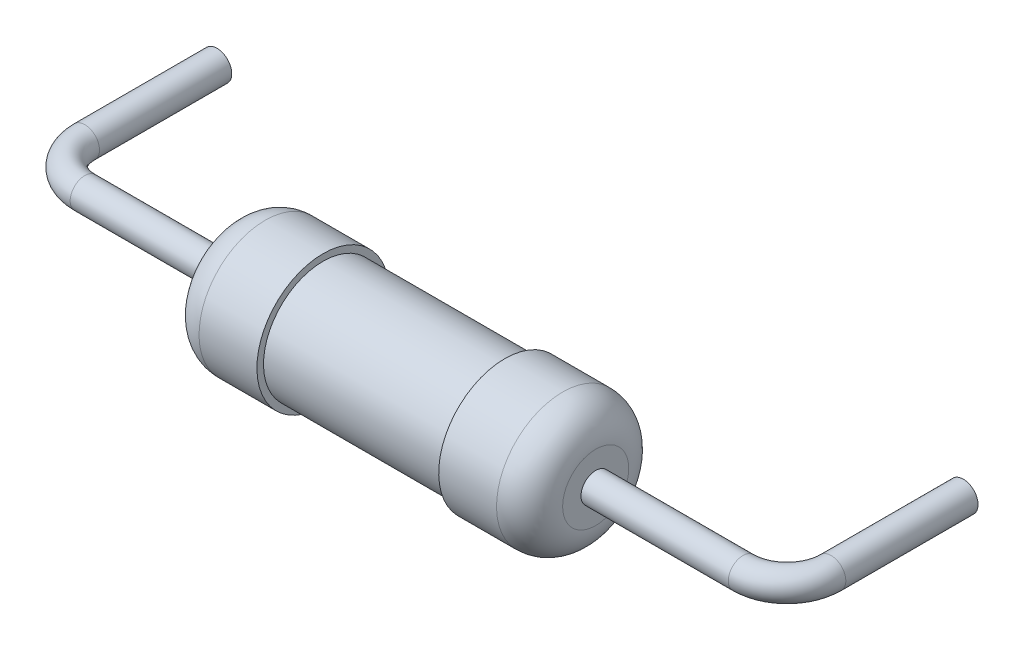
ISO-10303-21;
HEADER;
FILE_DESCRIPTION(('STEP AP214'),'2;1');
FILE_NAME('part.step','',(''),(''),'','','');
FILE_SCHEMA(('AUTOMOTIVE_DESIGN { 1 0 10303 214 1 1 1 1 }'));
ENDSEC;
DATA;
#1=APPLICATION_CONTEXT('core data for automotive mechanical design processes');
#2=APPLICATION_PROTOCOL_DEFINITION('international standard','automotive_design',2000,#1);
#3=PRODUCT_CONTEXT('',#1,'mechanical');
#4=PRODUCT('Part','Part','',(#3));
#5=PRODUCT_RELATED_PRODUCT_CATEGORY('part','',(#4));
#6=PRODUCT_DEFINITION_FORMATION('','',#4);
#7=PRODUCT_DEFINITION_CONTEXT('part definition',#1,'design');
#8=PRODUCT_DEFINITION('design','',#6,#7);
#9=PRODUCT_DEFINITION_SHAPE('','',#8);
#10=(LENGTH_UNIT() NAMED_UNIT(*) SI_UNIT(.MILLI.,.METRE.));
#11=(NAMED_UNIT(*) PLANE_ANGLE_UNIT() SI_UNIT($,.RADIAN.));
#12=(NAMED_UNIT(*) SI_UNIT($,.STERADIAN.) SOLID_ANGLE_UNIT());
#13=UNCERTAINTY_MEASURE_WITH_UNIT(LENGTH_MEASURE(1.E-05),#10,'distance_accuracy_value','');
#14=(GEOMETRIC_REPRESENTATION_CONTEXT(3) GLOBAL_UNCERTAINTY_ASSIGNED_CONTEXT((#13)) GLOBAL_UNIT_ASSIGNED_CONTEXT((#10,
#11,#12)) REPRESENTATION_CONTEXT('',''));
#15=CARTESIAN_POINT('',(0.,0.,0.));
#16=DIRECTION('',(0.,0.,1.));
#17=DIRECTION('',(1.,0.,0.));
#18=AXIS2_PLACEMENT_3D('',#15,#16,#17);
#19=CARTESIAN_POINT('',(19.92,0.,-3.));
#20=DIRECTION('',(0.,0.,1.));
#21=DIRECTION('',(1.,0.,0.));
#22=AXIS2_PLACEMENT_3D('',#19,#20,#21);
#23=PLANE('',#22);
#24=CARTESIAN_POINT('',(20.32,0.,-3.));
#25=DIRECTION('',(0.,0.,-1.));
#26=DIRECTION('',(-1.,0.,0.));
#27=AXIS2_PLACEMENT_3D('',#24,#25,#26);
#28=CIRCLE('',#27,0.4);
#29=CARTESIAN_POINT('',(19.92,0.,-3.));
#30=VERTEX_POINT('',#29);
#31=EDGE_CURVE('E11',#30,#30,#28,.T.);
#32=ORIENTED_EDGE('',*,*,#31,.T.);
#33=EDGE_LOOP('',(#32));
#34=FACE_BOUND('',#33,.T.);
#35=ADVANCED_FACE('F17',(#34),#23,.F.);
#36=CARTESIAN_POINT('',(20.32,0.,0.6));
#37=DIRECTION('',(0.,0.,-1.));
#38=DIRECTION('',(-1.,0.,0.));
#39=AXIS2_PLACEMENT_3D('',#36,#37,#38);
#40=CYLINDRICAL_SURFACE('',#39,0.4);
#41=DIRECTION('',(0.,0.,-1.));
#42=VECTOR('',#41,1.);
#43=CARTESIAN_POINT('',(19.92,0.,0.6));
#44=LINE('',#43,#42);
#45=CARTESIAN_POINT('',(19.92,0.,0.6));
#46=VERTEX_POINT('',#45);
#47=EDGE_CURVE('E26',#46,#30,#44,.T.);
#48=ORIENTED_EDGE('',*,*,#47,.T.);
#49=ORIENTED_EDGE('',*,*,#31,.F.);
#50=ORIENTED_EDGE('',*,*,#47,.F.);
#51=CARTESIAN_POINT('',(20.32,0.,0.6));
#52=DIRECTION('',(0.,0.,1.));
#53=DIRECTION('',(1.,0.,0.));
#54=AXIS2_PLACEMENT_3D('',#51,#52,#53);
#55=CIRCLE('',#54,0.4);
#56=EDGE_CURVE('E130',#46,#46,#55,.T.);
#57=ORIENTED_EDGE('',*,*,#56,.F.);
#58=EDGE_LOOP('',(#48,#49,#50,#57));
#59=FACE_BOUND('',#58,.T.);
#60=ADVANCED_FACE('F233',(#59),#40,.T.);
#61=CARTESIAN_POINT('',(19.12,0.,0.6));
#62=DIRECTION('',(0.,1.,0.));
#63=DIRECTION('',(0.,0.,1.));
#64=AXIS2_PLACEMENT_3D('',#61,#62,#63);
#65=TOROIDAL_SURFACE('',#64,1.2,0.4);
#66=CARTESIAN_POINT('',(19.12,0.,0.6));
#67=DIRECTION('',(0.,1.,0.));
#68=DIRECTION('',(0.,0.,1.));
#69=AXIS2_PLACEMENT_3D('',#66,#67,#68);
#70=CIRCLE('',#69,0.8);
#71=CARTESIAN_POINT('',(19.12,0.,1.4));
#72=VERTEX_POINT('',#71);
#73=EDGE_CURVE('E127',#72,#46,#70,.T.);
#74=ORIENTED_EDGE('',*,*,#73,.T.);
#75=ORIENTED_EDGE('',*,*,#56,.T.);
#76=ORIENTED_EDGE('',*,*,#73,.F.);
#77=CARTESIAN_POINT('',(19.12,0.,1.8));
#78=DIRECTION('',(1.,0.,0.));
#79=DIRECTION('',(0.,0.,-1.));
#80=AXIS2_PLACEMENT_3D('',#77,#78,#79);
#81=CIRCLE('',#80,0.4);
#82=EDGE_CURVE('E124',#72,#72,#81,.T.);
#83=ORIENTED_EDGE('',*,*,#82,.T.);
#84=EDGE_LOOP('',(#74,#75,#76,#83));
#85=FACE_BOUND('',#84,.T.);
#86=ADVANCED_FACE('F239',(#85),#65,.T.);
#87=CARTESIAN_POINT('',(1.2,0.,1.8));
#88=DIRECTION('',(1.,0.,0.));
#89=DIRECTION('',(0.,0.,-1.));
#90=AXIS2_PLACEMENT_3D('',#87,#88,#89);
#91=CYLINDRICAL_SURFACE('',#90,0.4);
#92=CARTESIAN_POINT('',(15.11,0.,1.8));
#93=DIRECTION('',(1.,0.,0.));
#94=DIRECTION('',(0.,0.,-1.));
#95=AXIS2_PLACEMENT_3D('',#92,#93,#94);
#96=CIRCLE('',#95,0.4);
#97=CARTESIAN_POINT('',(15.11,0.,1.4));
#98=VERTEX_POINT('',#97);
#99=EDGE_CURVE('E116',#98,#98,#96,.T.);
#100=ORIENTED_EDGE('',*,*,#99,.T.);
#101=DIRECTION('',(1.,0.,0.));
#102=VECTOR('',#101,1.);
#103=CARTESIAN_POINT('',(1.2,0.,1.4));
#104=LINE('',#103,#102);
#105=EDGE_CURVE('E120',#98,#72,#104,.T.);
#106=ORIENTED_EDGE('',*,*,#105,.T.);
#107=ORIENTED_EDGE('',*,*,#82,.F.);
#108=ORIENTED_EDGE('',*,*,#105,.F.);
#109=EDGE_LOOP('',(#100,#106,#107,#108));
#110=FACE_BOUND('',#109,.T.);
#111=ADVANCED_FACE('F243',(#110),#91,.T.);
#112=CARTESIAN_POINT('',(15.11,1.8,1.8));
#113=DIRECTION('',(-1.,0.,0.));
#114=DIRECTION('',(0.,0.,1.));
#115=AXIS2_PLACEMENT_3D('',#112,#113,#114);
#116=PLANE('',#115);
#117=ORIENTED_EDGE('',*,*,#99,.F.);
#118=EDGE_LOOP('',(#117));
#119=FACE_BOUND('',#118,.T.);
#120=CARTESIAN_POINT('',(15.11,0.,1.8));
#121=DIRECTION('',(1.,0.,0.));
#122=DIRECTION('',(0.,1.,0.));
#123=AXIS2_PLACEMENT_3D('',#120,#121,#122);
#124=CIRCLE('',#123,0.9);
#125=CARTESIAN_POINT('',(15.11,0.9,1.8));
#126=VERTEX_POINT('',#125);
#127=EDGE_CURVE('E108',#126,#126,#124,.T.);
#128=ORIENTED_EDGE('',*,*,#127,.T.);
#129=EDGE_LOOP('',(#128));
#130=FACE_BOUND('',#129,.T.);
#131=ADVANCED_FACE('F248',(#119,#130),#116,.F.);
#132=CARTESIAN_POINT('',(0.4,0.,-3.));
#133=DIRECTION('',(0.,0.,-1.));
#134=DIRECTION('',(0.,-1.,0.));
#135=AXIS2_PLACEMENT_3D('',#132,#133,#134);
#136=PLANE('',#135);
#137=CARTESIAN_POINT('',(0.,0.,-3.));
#138=DIRECTION('',(0.,0.,1.));
#139=DIRECTION('',(1.,0.,0.));
#140=AXIS2_PLACEMENT_3D('',#137,#138,#139);
#141=CIRCLE('',#140,0.4);
#142=CARTESIAN_POINT('',(0.4,0.,-3.));
#143=VERTEX_POINT('',#142);
#144=EDGE_CURVE('E95',#143,#143,#141,.T.);
#145=ORIENTED_EDGE('',*,*,#144,.F.);
#146=EDGE_LOOP('',(#145));
#147=FACE_BOUND('',#146,.T.);
#148=ADVANCED_FACE('F250',(#147),#136,.T.);
#149=CARTESIAN_POINT('',(14.21,0.,1.8));
#150=DIRECTION('',(1.,0.,0.));
#151=DIRECTION('',(0.,1.,0.));
#152=AXIS2_PLACEMENT_3D('',#149,#150,#151);
#153=DEGENERATE_TOROIDAL_SURFACE('',#152,0.9,0.9,.T.);
#154=CARTESIAN_POINT('',(14.21,0.9,1.8));
#155=DIRECTION('',(0.,0.,-1.));
#156=DIRECTION('',(0.,1.,0.));
#157=AXIS2_PLACEMENT_3D('',#154,#155,#156);
#158=CIRCLE('',#157,0.9);
#159=CARTESIAN_POINT('',(14.21,1.8,1.8));
#160=VERTEX_POINT('',#159);
#161=EDGE_CURVE('E102',#160,#126,#158,.T.);
#162=ORIENTED_EDGE('',*,*,#161,.F.);
#163=CARTESIAN_POINT('',(14.21,0.,1.8));
#164=DIRECTION('',(1.,0.,0.));
#165=DIRECTION('',(0.,1.,0.));
#166=AXIS2_PLACEMENT_3D('',#163,#164,#165);
#167=CIRCLE('',#166,1.8);
#168=EDGE_CURVE('E110',#160,#160,#167,.T.);
#169=ORIENTED_EDGE('',*,*,#168,.T.);
#170=ORIENTED_EDGE('',*,*,#161,.T.);
#171=ORIENTED_EDGE('',*,*,#127,.F.);
#172=EDGE_LOOP('',(#162,#169,#170,#171));
#173=FACE_BOUND('',#172,.T.);
#174=ADVANCED_FACE('F251',(#173),#153,.T.);
#175=CARTESIAN_POINT('',(0.,0.,-3.));
#176=DIRECTION('',(0.,0.,1.));
#177=DIRECTION('',(1.,0.,0.));
#178=AXIS2_PLACEMENT_3D('',#175,#176,#177);
#179=CYLINDRICAL_SURFACE('',#178,0.4);
#180=DIRECTION('',(0.,0.,1.));
#181=VECTOR('',#180,1.);
#182=CARTESIAN_POINT('',(0.4,0.,-3.));
#183=LINE('',#182,#181);
#184=CARTESIAN_POINT('',(0.4,0.,0.6));
#185=VERTEX_POINT('',#184);
#186=EDGE_CURVE('E98',#143,#185,#183,.T.);
#187=ORIENTED_EDGE('',*,*,#186,.T.);
#188=CARTESIAN_POINT('',(0.,0.,0.6));
#189=DIRECTION('',(0.,0.,1.));
#190=DIRECTION('',(1.,0.,0.));
#191=AXIS2_PLACEMENT_3D('',#188,#189,#190);
#192=CIRCLE('',#191,0.4);
#193=EDGE_CURVE('E149',#185,#185,#192,.T.);
#194=ORIENTED_EDGE('',*,*,#193,.F.);
#195=ORIENTED_EDGE('',*,*,#186,.F.);
#196=ORIENTED_EDGE('',*,*,#144,.T.);
#197=EDGE_LOOP('',(#187,#194,#195,#196));
#198=FACE_BOUND('',#197,.T.);
#199=ADVANCED_FACE('F96',(#198),#179,.T.);
#200=CARTESIAN_POINT('',(12.635,0.,1.8));
#201=DIRECTION('',(-1.,0.,0.));
#202=DIRECTION('',(0.,1.,0.));
#203=AXIS2_PLACEMENT_3D('',#200,#201,#202);
#204=CYLINDRICAL_SURFACE('',#203,1.8);
#205=CARTESIAN_POINT('',(12.635,0.,1.8));
#206=DIRECTION('',(1.,0.,0.));
#207=DIRECTION('',(0.,1.,0.));
#208=AXIS2_PLACEMENT_3D('',#205,#206,#207);
#209=CIRCLE('',#208,1.8);
#210=CARTESIAN_POINT('',(12.635,1.8,1.8));
#211=VERTEX_POINT('',#210);
#212=EDGE_CURVE('E162',#211,#211,#209,.T.);
#213=ORIENTED_EDGE('',*,*,#212,.T.);
#214=DIRECTION('',(1.,0.,0.));
#215=VECTOR('',#214,1.);
#216=CARTESIAN_POINT('',(12.635,1.8,1.8));
#217=LINE('',#216,#215);
#218=EDGE_CURVE('E147',#211,#160,#217,.T.);
#219=ORIENTED_EDGE('',*,*,#218,.T.);
#220=ORIENTED_EDGE('',*,*,#168,.F.);
#221=ORIENTED_EDGE('',*,*,#218,.F.);
#222=EDGE_LOOP('',(#213,#219,#220,#221));
#223=FACE_BOUND('',#222,.T.);
#224=ADVANCED_FACE('F253',(#223),#204,.T.);
#225=CARTESIAN_POINT('',(1.2,0.,0.6));
#226=DIRECTION('',(0.,1.,0.));
#227=DIRECTION('',(-1.,0.,0.));
#228=AXIS2_PLACEMENT_3D('',#225,#226,#227);
#229=TOROIDAL_SURFACE('',#228,1.2,0.4);
#230=CARTESIAN_POINT('',(1.2,0.,0.6));
#231=DIRECTION('',(0.,1.,0.));
#232=DIRECTION('',(-1.,0.,0.));
#233=AXIS2_PLACEMENT_3D('',#230,#231,#232);
#234=CIRCLE('',#233,0.8);
#235=CARTESIAN_POINT('',(1.2,0.,1.4));
#236=VERTEX_POINT('',#235);
#237=EDGE_CURVE('E145',#185,#236,#234,.T.);
#238=ORIENTED_EDGE('',*,*,#237,.T.);
#239=CARTESIAN_POINT('',(1.2,0.,1.8));
#240=DIRECTION('',(-1.,0.,0.));
#241=DIRECTION('',(0.,0.,1.));
#242=AXIS2_PLACEMENT_3D('',#239,#240,#241);
#243=CIRCLE('',#242,0.4);
#244=EDGE_CURVE('E168',#236,#236,#243,.T.);
#245=ORIENTED_EDGE('',*,*,#244,.T.);
#246=ORIENTED_EDGE('',*,*,#237,.F.);
#247=ORIENTED_EDGE('',*,*,#193,.T.);
#248=EDGE_LOOP('',(#238,#245,#246,#247));
#249=FACE_BOUND('',#248,.T.);
#250=ADVANCED_FACE('F256',(#249),#229,.T.);
#251=CARTESIAN_POINT('',(12.635,1.8,1.8));
#252=DIRECTION('',(-1.,0.,0.));
#253=DIRECTION('',(0.,0.,1.));
#254=AXIS2_PLACEMENT_3D('',#251,#252,#253);
#255=PLANE('',#254);
#256=CARTESIAN_POINT('',(12.635,0.,1.8));
#257=DIRECTION('',(-1.,0.,0.));
#258=DIRECTION('',(0.,1.,0.));
#259=AXIS2_PLACEMENT_3D('',#256,#257,#258);
#260=CIRCLE('',#259,1.62);
#261=CARTESIAN_POINT('',(12.635,1.62,1.8));
#262=VERTEX_POINT('',#261);
#263=EDGE_CURVE('E171',#262,#262,#260,.T.);
#264=ORIENTED_EDGE('',*,*,#263,.F.);
#265=EDGE_LOOP('',(#264));
#266=FACE_BOUND('',#265,.T.);
#267=ORIENTED_EDGE('',*,*,#212,.F.);
#268=EDGE_LOOP('',(#267));
#269=FACE_BOUND('',#268,.T.);
#270=ADVANCED_FACE('F259',(#266,#269),#255,.T.);
#271=CARTESIAN_POINT('',(1.2,0.,1.8));
#272=DIRECTION('',(1.,0.,0.));
#273=DIRECTION('',(0.,0.,-1.));
#274=AXIS2_PLACEMENT_3D('',#271,#272,#273);
#275=CYLINDRICAL_SURFACE('',#274,0.4);
#276=ORIENTED_EDGE('',*,*,#244,.F.);
#277=DIRECTION('',(1.,0.,0.));
#278=VECTOR('',#277,1.);
#279=CARTESIAN_POINT('',(1.2,0.,1.4));
#280=LINE('',#279,#278);
#281=CARTESIAN_POINT('',(5.21,0.,1.4));
#282=VERTEX_POINT('',#281);
#283=EDGE_CURVE('E165',#236,#282,#280,.T.);
#284=ORIENTED_EDGE('',*,*,#283,.T.);
#285=CARTESIAN_POINT('',(5.21,0.,1.8));
#286=DIRECTION('',(1.,0.,0.));
#287=DIRECTION('',(0.,0.,-1.));
#288=AXIS2_PLACEMENT_3D('',#285,#286,#287);
#289=CIRCLE('',#288,0.4);
#290=EDGE_CURVE('E177',#282,#282,#289,.T.);
#291=ORIENTED_EDGE('',*,*,#290,.F.);
#292=ORIENTED_EDGE('',*,*,#283,.F.);
#293=EDGE_LOOP('',(#276,#284,#291,#292));
#294=FACE_BOUND('',#293,.T.);
#295=ADVANCED_FACE('F228',(#294),#275,.T.);
#296=CARTESIAN_POINT('',(5.21,0.,1.8));
#297=DIRECTION('',(-1.,0.,0.));
#298=DIRECTION('',(0.,1.,0.));
#299=AXIS2_PLACEMENT_3D('',#296,#297,#298);
#300=CYLINDRICAL_SURFACE('',#299,1.62);
#301=ORIENTED_EDGE('',*,*,#263,.T.);
#302=DIRECTION('',(1.,0.,0.));
#303=VECTOR('',#302,1.);
#304=CARTESIAN_POINT('',(5.21,1.62,1.8));
#305=LINE('',#304,#303);
#306=CARTESIAN_POINT('',(7.685,1.62,1.8));
#307=VERTEX_POINT('',#306);
#308=EDGE_CURVE('E169',#307,#262,#305,.T.);
#309=ORIENTED_EDGE('',*,*,#308,.F.);
#310=CARTESIAN_POINT('',(7.685,0.,1.8));
#311=DIRECTION('',(-1.,0.,0.));
#312=DIRECTION('',(0.,1.,0.));
#313=AXIS2_PLACEMENT_3D('',#310,#311,#312);
#314=CIRCLE('',#313,1.62);
#315=EDGE_CURVE('E173',#307,#307,#314,.T.);
#316=ORIENTED_EDGE('',*,*,#315,.F.);
#317=ORIENTED_EDGE('',*,*,#308,.T.);
#318=EDGE_LOOP('',(#301,#309,#316,#317));
#319=FACE_BOUND('',#318,.T.);
#320=ADVANCED_FACE('F217',(#319),#300,.T.);
#321=CARTESIAN_POINT('',(5.21,1.8,1.8));
#322=DIRECTION('',(-1.,0.,0.));
#323=DIRECTION('',(0.,0.,1.));
#324=AXIS2_PLACEMENT_3D('',#321,#322,#323);
#325=PLANE('',#324);
#326=ORIENTED_EDGE('',*,*,#290,.T.);
#327=EDGE_LOOP('',(#326));
#328=FACE_BOUND('',#327,.T.);
#329=CARTESIAN_POINT('',(5.21,0.,1.8));
#330=DIRECTION('',(1.,0.,0.));
#331=DIRECTION('',(0.,1.,0.));
#332=AXIS2_PLACEMENT_3D('',#329,#330,#331);
#333=CIRCLE('',#332,0.9);
#334=CARTESIAN_POINT('',(5.21,0.9,1.8));
#335=VERTEX_POINT('',#334);
#336=EDGE_CURVE('E184',#335,#335,#333,.T.);
#337=ORIENTED_EDGE('',*,*,#336,.F.);
#338=EDGE_LOOP('',(#337));
#339=FACE_BOUND('',#338,.T.);
#340=ADVANCED_FACE('F214',(#328,#339),#325,.T.);
#341=CARTESIAN_POINT('',(7.685,1.8,1.8));
#342=DIRECTION('',(-1.,0.,0.));
#343=DIRECTION('',(0.,0.,1.));
#344=AXIS2_PLACEMENT_3D('',#341,#342,#343);
#345=PLANE('',#344);
#346=ORIENTED_EDGE('',*,*,#315,.T.);
#347=EDGE_LOOP('',(#346));
#348=FACE_BOUND('',#347,.T.);
#349=CARTESIAN_POINT('',(7.685,0.,1.8));
#350=DIRECTION('',(1.,0.,0.));
#351=DIRECTION('',(0.,1.,0.));
#352=AXIS2_PLACEMENT_3D('',#349,#350,#351);
#353=CIRCLE('',#352,1.8);
#354=CARTESIAN_POINT('',(7.685,1.8,1.8));
#355=VERTEX_POINT('',#354);
#356=EDGE_CURVE('E191',#355,#355,#353,.T.);
#357=ORIENTED_EDGE('',*,*,#356,.T.);
#358=EDGE_LOOP('',(#357));
#359=FACE_BOUND('',#358,.T.);
#360=ADVANCED_FACE('F216',(#348,#359),#345,.F.);
#361=CARTESIAN_POINT('',(6.11,0.,1.8));
#362=DIRECTION('',(-1.,0.,0.));
#363=DIRECTION('',(0.,1.,0.));
#364=AXIS2_PLACEMENT_3D('',#361,#362,#363);
#365=DEGENERATE_TOROIDAL_SURFACE('',#364,0.9,0.9,.T.);
#366=ORIENTED_EDGE('',*,*,#336,.T.);
#367=CARTESIAN_POINT('',(6.11,0.9,1.8));
#368=DIRECTION('',(0.,0.,1.));
#369=DIRECTION('',(0.,1.,0.));
#370=AXIS2_PLACEMENT_3D('',#367,#368,#369);
#371=CIRCLE('',#370,0.9);
#372=CARTESIAN_POINT('',(6.11,1.8,1.8));
#373=VERTEX_POINT('',#372);
#374=EDGE_CURVE('E178',#373,#335,#371,.T.);
#375=ORIENTED_EDGE('',*,*,#374,.F.);
#376=CARTESIAN_POINT('',(6.11,0.,1.8));
#377=DIRECTION('',(1.,0.,0.));
#378=DIRECTION('',(0.,1.,0.));
#379=AXIS2_PLACEMENT_3D('',#376,#377,#378);
#380=CIRCLE('',#379,1.8);
#381=EDGE_CURVE('E198',#373,#373,#380,.T.);
#382=ORIENTED_EDGE('',*,*,#381,.F.);
#383=ORIENTED_EDGE('',*,*,#374,.T.);
#384=EDGE_LOOP('',(#366,#375,#382,#383));
#385=FACE_BOUND('',#384,.T.);
#386=ADVANCED_FACE('F211',(#385),#365,.T.);
#387=CARTESIAN_POINT('',(5.21,0.,1.8));
#388=DIRECTION('',(-1.,0.,0.));
#389=DIRECTION('',(0.,1.,0.));
#390=AXIS2_PLACEMENT_3D('',#387,#388,#389);
#391=CYLINDRICAL_SURFACE('',#390,1.8);
#392=ORIENTED_EDGE('',*,*,#381,.T.);
#393=DIRECTION('',(1.,0.,0.));
#394=VECTOR('',#393,1.);
#395=CARTESIAN_POINT('',(5.21,1.8,1.8));
#396=LINE('',#395,#394);
#397=EDGE_CURVE('E194',#373,#355,#396,.T.);
#398=ORIENTED_EDGE('',*,*,#397,.T.);
#399=ORIENTED_EDGE('',*,*,#356,.F.);
#400=ORIENTED_EDGE('',*,*,#397,.F.);
#401=EDGE_LOOP('',(#392,#398,#399,#400));
#402=FACE_BOUND('',#401,.T.);
#403=ADVANCED_FACE('F208',(#402),#391,.T.);
#404=CLOSED_SHELL('',(#35,#60,#86,#111,#131,#148,#174,#199,#224,#250,#270,#295,#320,#340,#360,
#386,#403));
#405=MANIFOLD_SOLID_BREP('B1',#404);
#406=ADVANCED_BREP_SHAPE_REPRESENTATION('',(#18,#405),#14);
#407=SHAPE_DEFINITION_REPRESENTATION(#9,#406);
ENDSEC;
END-ISO-10303-21;
